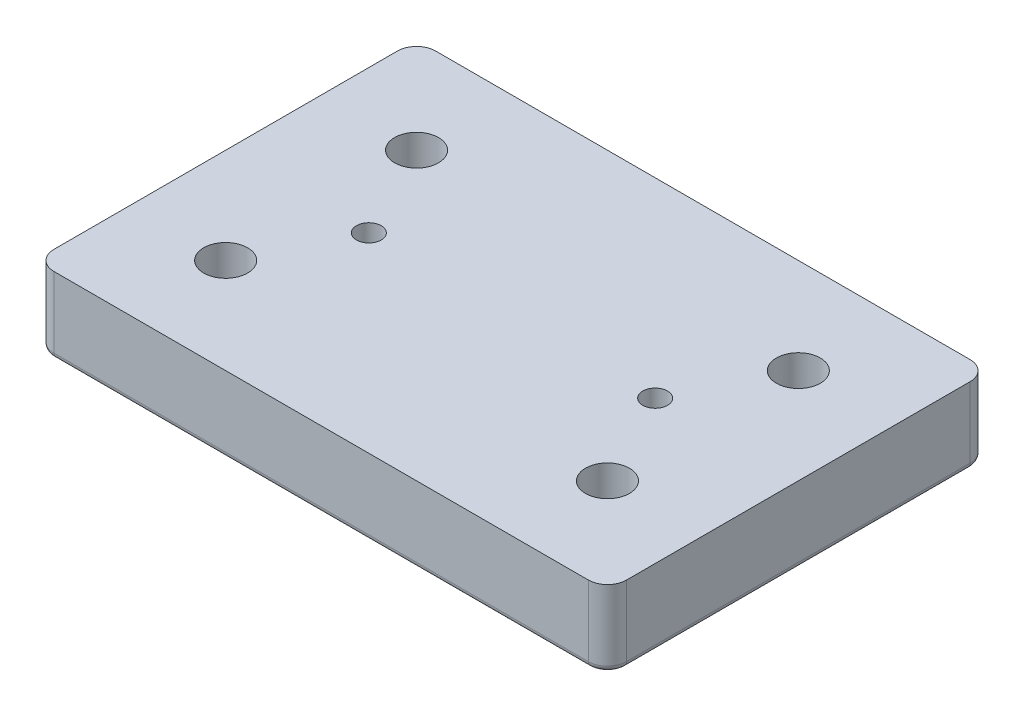
ISO-10303-21;
HEADER;
FILE_DESCRIPTION(('STEP AP214'),'2;1');
FILE_NAME('part.step','',(''),(''),'','','');
FILE_SCHEMA(('AUTOMOTIVE_DESIGN { 1 0 10303 214 1 1 1 1 }'));
ENDSEC;
DATA;
#1=APPLICATION_CONTEXT('core data for automotive mechanical design processes');
#2=APPLICATION_PROTOCOL_DEFINITION('international standard','automotive_design',2000,#1);
#3=PRODUCT_CONTEXT('',#1,'mechanical');
#4=PRODUCT('Part','Part','',(#3));
#5=PRODUCT_RELATED_PRODUCT_CATEGORY('part','',(#4));
#6=PRODUCT_DEFINITION_FORMATION('','',#4);
#7=PRODUCT_DEFINITION_CONTEXT('part definition',#1,'design');
#8=PRODUCT_DEFINITION('design','',#6,#7);
#9=PRODUCT_DEFINITION_SHAPE('','',#8);
#10=(LENGTH_UNIT() NAMED_UNIT(*) SI_UNIT(.MILLI.,.METRE.));
#11=(NAMED_UNIT(*) PLANE_ANGLE_UNIT() SI_UNIT($,.RADIAN.));
#12=(NAMED_UNIT(*) SI_UNIT($,.STERADIAN.) SOLID_ANGLE_UNIT());
#13=UNCERTAINTY_MEASURE_WITH_UNIT(LENGTH_MEASURE(1.E-05),#10,'distance_accuracy_value','');
#14=(GEOMETRIC_REPRESENTATION_CONTEXT(3) GLOBAL_UNCERTAINTY_ASSIGNED_CONTEXT((#13)) GLOBAL_UNIT_ASSIGNED_CONTEXT((#10,
#11,#12)) REPRESENTATION_CONTEXT('',''));
#15=CARTESIAN_POINT('',(0.,0.,0.));
#16=DIRECTION('',(0.,0.,1.));
#17=DIRECTION('',(1.,0.,0.));
#18=AXIS2_PLACEMENT_3D('',#15,#16,#17);
#19=CARTESIAN_POINT('',(0.,0.,0.));
#20=DIRECTION('',(0.,-1.,0.));
#21=DIRECTION('',(0.,0.,-1.));
#22=AXIS2_PLACEMENT_3D('',#19,#20,#21);
#23=PLANE('',#22);
#24=CARTESIAN_POINT('',(-10.,0.,5.));
#25=DIRECTION('',(0.,-1.,0.));
#26=DIRECTION('',(0.,0.,-1.));
#27=AXIS2_PLACEMENT_3D('',#24,#25,#26);
#28=CIRCLE('',#27,1.15);
#29=CARTESIAN_POINT('',(-10.,0.,3.85));
#30=VERTEX_POINT('',#29);
#31=EDGE_CURVE('E188',#30,#30,#28,.T.);
#32=ORIENTED_EDGE('',*,*,#31,.F.);
#33=EDGE_LOOP('',(#32));
#34=FACE_BOUND('',#33,.T.);
#35=CARTESIAN_POINT('',(10.,0.,-5.));
#36=DIRECTION('',(0.,-1.,0.));
#37=DIRECTION('',(0.,0.,-1.));
#38=AXIS2_PLACEMENT_3D('',#35,#36,#37);
#39=CIRCLE('',#38,1.15);
#40=CARTESIAN_POINT('',(10.,0.,-6.15));
#41=VERTEX_POINT('',#40);
#42=EDGE_CURVE('E196',#41,#41,#39,.T.);
#43=ORIENTED_EDGE('',*,*,#42,.F.);
#44=EDGE_LOOP('',(#43));
#45=FACE_BOUND('',#44,.T.);
#46=CARTESIAN_POINT('',(-10.,0.,-5.));
#47=DIRECTION('',(0.,-1.,0.));
#48=DIRECTION('',(0.,0.,-1.));
#49=AXIS2_PLACEMENT_3D('',#46,#47,#48);
#50=CIRCLE('',#49,1.15);
#51=CARTESIAN_POINT('',(-10.,0.,-6.15));
#52=VERTEX_POINT('',#51);
#53=EDGE_CURVE('E192',#52,#52,#50,.T.);
#54=ORIENTED_EDGE('',*,*,#53,.F.);
#55=EDGE_LOOP('',(#54));
#56=FACE_BOUND('',#55,.T.);
#57=CARTESIAN_POINT('',(10.,0.,5.));
#58=DIRECTION('',(0.,-1.,0.));
#59=DIRECTION('',(0.,0.,-1.));
#60=AXIS2_PLACEMENT_3D('',#57,#58,#59);
#61=CIRCLE('',#60,1.15);
#62=CARTESIAN_POINT('',(10.,0.,3.85));
#63=VERTEX_POINT('',#62);
#64=EDGE_CURVE('E189',#63,#63,#61,.T.);
#65=ORIENTED_EDGE('',*,*,#64,.F.);
#66=EDGE_LOOP('',(#65));
#67=FACE_BOUND('',#66,.T.);
#68=CARTESIAN_POINT('',(7.5,0.,0.));
#69=DIRECTION('',(0.,1.,0.));
#70=DIRECTION('',(0.,0.,1.));
#71=AXIS2_PLACEMENT_3D('',#68,#69,#70);
#72=CIRCLE('',#71,0.649999999999999);
#73=CARTESIAN_POINT('',(7.5,0.,0.649999999999999));
#74=VERTEX_POINT('',#73);
#75=EDGE_CURVE('E325',#74,#74,#72,.T.);
#76=ORIENTED_EDGE('',*,*,#75,.T.);
#77=EDGE_LOOP('',(#76));
#78=FACE_BOUND('',#77,.T.);
#79=CARTESIAN_POINT('',(-7.5,0.,0.));
#80=DIRECTION('',(0.,1.,0.));
#81=DIRECTION('',(0.,0.,-1.));
#82=AXIS2_PLACEMENT_3D('',#79,#80,#81);
#83=CIRCLE('',#82,0.65);
#84=CARTESIAN_POINT('',(-7.5,0.,-0.649999999999998));
#85=VERTEX_POINT('',#84);
#86=EDGE_CURVE('E331',#85,#85,#83,.T.);
#87=ORIENTED_EDGE('',*,*,#86,.T.);
#88=EDGE_LOOP('',(#87));
#89=FACE_BOUND('',#88,.T.);
#90=CARTESIAN_POINT('',(-14.,0.,9.));
#91=DIRECTION('',(0.,-1.,0.));
#92=DIRECTION('',(0.,0.,-1.));
#93=AXIS2_PLACEMENT_3D('',#90,#91,#92);
#94=CIRCLE('',#93,0.7);
#95=CARTESIAN_POINT('',(-14.7,0.,9.));
#96=VERTEX_POINT('',#95);
#97=CARTESIAN_POINT('',(-14.,0.,9.7));
#98=VERTEX_POINT('',#97);
#99=EDGE_CURVE('E202',#96,#98,#94,.F.);
#100=ORIENTED_EDGE('',*,*,#99,.F.);
#101=DIRECTION('',(0.,0.,1.));
#102=VECTOR('',#101,1.);
#103=CARTESIAN_POINT('',(-14.7,0.,-10.));
#104=LINE('',#103,#102);
#105=CARTESIAN_POINT('',(-14.7,0.,-9.));
#106=VERTEX_POINT('',#105);
#107=EDGE_CURVE('E145',#96,#106,#104,.F.);
#108=ORIENTED_EDGE('',*,*,#107,.T.);
#109=CARTESIAN_POINT('',(-14.,0.,-9.));
#110=DIRECTION('',(0.,-1.,0.));
#111=DIRECTION('',(0.,0.,-1.));
#112=AXIS2_PLACEMENT_3D('',#109,#110,#111);
#113=CIRCLE('',#112,0.7);
#114=CARTESIAN_POINT('',(-14.,0.,-9.7));
#115=VERTEX_POINT('',#114);
#116=EDGE_CURVE('E140',#115,#106,#113,.F.);
#117=ORIENTED_EDGE('',*,*,#116,.F.);
#118=DIRECTION('',(-1.,0.,0.));
#119=VECTOR('',#118,1.);
#120=CARTESIAN_POINT('',(15.,0.,-9.7));
#121=LINE('',#120,#119);
#122=CARTESIAN_POINT('',(14.,0.,-9.7));
#123=VERTEX_POINT('',#122);
#124=EDGE_CURVE('E133',#115,#123,#121,.F.);
#125=ORIENTED_EDGE('',*,*,#124,.T.);
#126=CARTESIAN_POINT('',(14.,0.,-9.));
#127=DIRECTION('',(0.,-1.,0.));
#128=DIRECTION('',(0.,0.,-1.));
#129=AXIS2_PLACEMENT_3D('',#126,#127,#128);
#130=CIRCLE('',#129,0.7);
#131=CARTESIAN_POINT('',(14.7,0.,-9.));
#132=VERTEX_POINT('',#131);
#133=EDGE_CURVE('E137',#132,#123,#130,.F.);
#134=ORIENTED_EDGE('',*,*,#133,.F.);
#135=DIRECTION('',(0.,0.,-1.));
#136=VECTOR('',#135,1.);
#137=CARTESIAN_POINT('',(14.7,0.,10.));
#138=LINE('',#137,#136);
#139=CARTESIAN_POINT('',(14.7,0.,9.));
#140=VERTEX_POINT('',#139);
#141=EDGE_CURVE('E144',#132,#140,#138,.F.);
#142=ORIENTED_EDGE('',*,*,#141,.T.);
#143=CARTESIAN_POINT('',(14.,0.,9.));
#144=DIRECTION('',(0.,-1.,0.));
#145=DIRECTION('',(0.,0.,-1.));
#146=AXIS2_PLACEMENT_3D('',#143,#144,#145);
#147=CIRCLE('',#146,0.7);
#148=CARTESIAN_POINT('',(14.,0.,9.7));
#149=VERTEX_POINT('',#148);
#150=EDGE_CURVE('E154',#149,#140,#147,.F.);
#151=ORIENTED_EDGE('',*,*,#150,.F.);
#152=DIRECTION('',(1.,0.,0.));
#153=VECTOR('',#152,1.);
#154=CARTESIAN_POINT('',(-15.,0.,9.7));
#155=LINE('',#154,#153);
#156=EDGE_CURVE('E252',#149,#98,#155,.F.);
#157=ORIENTED_EDGE('',*,*,#156,.T.);
#158=EDGE_LOOP('',(#100,#108,#117,#125,#134,#142,#151,#157));
#159=FACE_BOUND('',#158,.T.);
#160=ADVANCED_FACE('F41',(#34,#45,#56,#67,#78,#89,#159),#23,.T.);
#161=CARTESIAN_POINT('',(0.,4.,0.));
#162=DIRECTION('',(0.,-1.,0.));
#163=DIRECTION('',(0.,0.,-1.));
#164=AXIS2_PLACEMENT_3D('',#161,#162,#163);
#165=PLANE('',#164);
#166=CARTESIAN_POINT('',(10.,4.,5.));
#167=DIRECTION('',(0.,1.,0.));
#168=DIRECTION('',(0.,0.,1.));
#169=AXIS2_PLACEMENT_3D('',#166,#167,#168);
#170=CIRCLE('',#169,1.15);
#171=CARTESIAN_POINT('',(10.,4.,6.15));
#172=VERTEX_POINT('',#171);
#173=EDGE_CURVE('E342',#172,#172,#170,.T.);
#174=ORIENTED_EDGE('',*,*,#173,.F.);
#175=EDGE_LOOP('',(#174));
#176=FACE_BOUND('',#175,.T.);
#177=CARTESIAN_POINT('',(-10.,4.,-5.));
#178=DIRECTION('',(0.,1.,0.));
#179=DIRECTION('',(0.,0.,1.));
#180=AXIS2_PLACEMENT_3D('',#177,#178,#179);
#181=CIRCLE('',#180,1.15);
#182=CARTESIAN_POINT('',(-10.,4.,-3.85));
#183=VERTEX_POINT('',#182);
#184=EDGE_CURVE('E334',#183,#183,#181,.T.);
#185=ORIENTED_EDGE('',*,*,#184,.F.);
#186=EDGE_LOOP('',(#185));
#187=FACE_BOUND('',#186,.T.);
#188=DIRECTION('',(-1.,0.,0.));
#189=VECTOR('',#188,1.);
#190=CARTESIAN_POINT('',(-15.,4.,-10.));
#191=LINE('',#190,#189);
#192=CARTESIAN_POINT('',(14.,4.,-10.));
#193=VERTEX_POINT('',#192);
#194=CARTESIAN_POINT('',(-14.,4.,-10.));
#195=VERTEX_POINT('',#194);
#196=EDGE_CURVE('E236',#193,#195,#191,.T.);
#197=ORIENTED_EDGE('',*,*,#196,.T.);
#198=CARTESIAN_POINT('',(-14.,4.,-9.));
#199=DIRECTION('',(0.,-1.,0.));
#200=DIRECTION('',(0.,0.,-1.));
#201=AXIS2_PLACEMENT_3D('',#198,#199,#200);
#202=CIRCLE('',#201,1.);
#203=CARTESIAN_POINT('',(-15.,4.,-9.));
#204=VERTEX_POINT('',#203);
#205=EDGE_CURVE('E50',#195,#204,#202,.F.);
#206=ORIENTED_EDGE('',*,*,#205,.T.);
#207=DIRECTION('',(0.,0.,1.));
#208=VECTOR('',#207,1.);
#209=CARTESIAN_POINT('',(-15.,4.,10.));
#210=LINE('',#209,#208);
#211=CARTESIAN_POINT('',(-15.,4.,9.));
#212=VERTEX_POINT('',#211);
#213=EDGE_CURVE('E235',#204,#212,#210,.T.);
#214=ORIENTED_EDGE('',*,*,#213,.T.);
#215=CARTESIAN_POINT('',(-14.,4.,9.));
#216=DIRECTION('',(0.,-1.,0.));
#217=DIRECTION('',(0.,0.,-1.));
#218=AXIS2_PLACEMENT_3D('',#215,#216,#217);
#219=CIRCLE('',#218,1.);
#220=CARTESIAN_POINT('',(-14.,4.,10.));
#221=VERTEX_POINT('',#220);
#222=EDGE_CURVE('E58',#212,#221,#219,.F.);
#223=ORIENTED_EDGE('',*,*,#222,.T.);
#224=DIRECTION('',(1.,0.,0.));
#225=VECTOR('',#224,1.);
#226=CARTESIAN_POINT('',(-15.,4.,10.));
#227=LINE('',#226,#225);
#228=CARTESIAN_POINT('',(14.,4.,10.));
#229=VERTEX_POINT('',#228);
#230=EDGE_CURVE('E242',#221,#229,#227,.T.);
#231=ORIENTED_EDGE('',*,*,#230,.T.);
#232=CARTESIAN_POINT('',(14.,4.,9.));
#233=DIRECTION('',(0.,-1.,0.));
#234=DIRECTION('',(0.,0.,-1.));
#235=AXIS2_PLACEMENT_3D('',#232,#233,#234);
#236=CIRCLE('',#235,1.);
#237=CARTESIAN_POINT('',(15.,4.,9.));
#238=VERTEX_POINT('',#237);
#239=EDGE_CURVE('E175',#229,#238,#236,.F.);
#240=ORIENTED_EDGE('',*,*,#239,.T.);
#241=DIRECTION('',(0.,0.,-1.));
#242=VECTOR('',#241,1.);
#243=CARTESIAN_POINT('',(15.,4.,10.));
#244=LINE('',#243,#242);
#245=CARTESIAN_POINT('',(15.,4.,-9.));
#246=VERTEX_POINT('',#245);
#247=EDGE_CURVE('E246',#238,#246,#244,.T.);
#248=ORIENTED_EDGE('',*,*,#247,.T.);
#249=CARTESIAN_POINT('',(14.,4.,-9.));
#250=DIRECTION('',(0.,-1.,0.));
#251=DIRECTION('',(0.,0.,-1.));
#252=AXIS2_PLACEMENT_3D('',#249,#250,#251);
#253=CIRCLE('',#252,1.);
#254=EDGE_CURVE('E177',#246,#193,#253,.F.);
#255=ORIENTED_EDGE('',*,*,#254,.T.);
#256=EDGE_LOOP('',(#197,#206,#214,#223,#231,#240,#248,#255));
#257=FACE_BOUND('',#256,.T.);
#258=CARTESIAN_POINT('',(7.5,4.,0.));
#259=DIRECTION('',(0.,1.,0.));
#260=DIRECTION('',(0.,0.,1.));
#261=AXIS2_PLACEMENT_3D('',#258,#259,#260);
#262=CIRCLE('',#261,0.649999999999999);
#263=CARTESIAN_POINT('',(7.5,4.,0.649999999999999));
#264=VERTEX_POINT('',#263);
#265=EDGE_CURVE('E323',#264,#264,#262,.T.);
#266=ORIENTED_EDGE('',*,*,#265,.F.);
#267=EDGE_LOOP('',(#266));
#268=FACE_BOUND('',#267,.T.);
#269=CARTESIAN_POINT('',(-7.5,4.,0.));
#270=DIRECTION('',(0.,1.,0.));
#271=DIRECTION('',(0.,0.,-1.));
#272=AXIS2_PLACEMENT_3D('',#269,#270,#271);
#273=CIRCLE('',#272,0.65);
#274=CARTESIAN_POINT('',(-7.5,4.,-0.649999999999998));
#275=VERTEX_POINT('',#274);
#276=EDGE_CURVE('E329',#275,#275,#273,.T.);
#277=ORIENTED_EDGE('',*,*,#276,.F.);
#278=EDGE_LOOP('',(#277));
#279=FACE_BOUND('',#278,.T.);
#280=CARTESIAN_POINT('',(10.,4.,-5.));
#281=DIRECTION('',(0.,1.,0.));
#282=DIRECTION('',(0.,0.,1.));
#283=AXIS2_PLACEMENT_3D('',#280,#281,#282);
#284=CIRCLE('',#283,1.15);
#285=CARTESIAN_POINT('',(10.,4.,-3.85));
#286=VERTEX_POINT('',#285);
#287=EDGE_CURVE('E339',#286,#286,#284,.F.);
#288=ORIENTED_EDGE('',*,*,#287,.T.);
#289=EDGE_LOOP('',(#288));
#290=FACE_BOUND('',#289,.T.);
#291=CARTESIAN_POINT('',(-10.,4.,5.));
#292=DIRECTION('',(0.,1.,0.));
#293=DIRECTION('',(0.,0.,1.));
#294=AXIS2_PLACEMENT_3D('',#291,#292,#293);
#295=CIRCLE('',#294,1.15);
#296=CARTESIAN_POINT('',(-10.,4.,6.15));
#297=VERTEX_POINT('',#296);
#298=EDGE_CURVE('E185',#297,#297,#295,.F.);
#299=ORIENTED_EDGE('',*,*,#298,.T.);
#300=EDGE_LOOP('',(#299));
#301=FACE_BOUND('',#300,.T.);
#302=ADVANCED_FACE('F233',(#176,#187,#257,#268,#279,#290,#301),#165,.F.);
#303=CARTESIAN_POINT('',(15.,4.,10.));
#304=DIRECTION('',(-1.,0.,0.));
#305=DIRECTION('',(0.,0.,1.));
#306=AXIS2_PLACEMENT_3D('',#303,#304,#305);
#307=PLANE('',#306);
#308=DIRECTION('',(0.,0.,-1.));
#309=VECTOR('',#308,1.);
#310=CARTESIAN_POINT('',(15.,0.3,-10.));
#311=LINE('',#310,#309);
#312=CARTESIAN_POINT('',(15.,0.3,9.));
#313=VERTEX_POINT('',#312);
#314=CARTESIAN_POINT('',(15.,0.3,-9.));
#315=VERTEX_POINT('',#314);
#316=EDGE_CURVE('E244',#313,#315,#311,.T.);
#317=ORIENTED_EDGE('',*,*,#316,.T.);
#318=DIRECTION('',(0.,-1.,0.));
#319=VECTOR('',#318,1.);
#320=CARTESIAN_POINT('',(15.,4.,-9.));
#321=LINE('',#320,#319);
#322=EDGE_CURVE('E173',#315,#246,#321,.F.);
#323=ORIENTED_EDGE('',*,*,#322,.T.);
#324=ORIENTED_EDGE('',*,*,#247,.F.);
#325=DIRECTION('',(0.,-1.,0.));
#326=VECTOR('',#325,1.);
#327=CARTESIAN_POINT('',(15.,4.,9.));
#328=LINE('',#327,#326);
#329=EDGE_CURVE('E171',#238,#313,#328,.T.);
#330=ORIENTED_EDGE('',*,*,#329,.T.);
#331=EDGE_LOOP('',(#317,#323,#324,#330));
#332=FACE_BOUND('',#331,.T.);
#333=ADVANCED_FACE('F268',(#332),#307,.F.);
#334=CARTESIAN_POINT('',(-15.,4.,-10.));
#335=DIRECTION('',(0.,0.,1.));
#336=DIRECTION('',(1.,0.,0.));
#337=AXIS2_PLACEMENT_3D('',#334,#335,#336);
#338=PLANE('',#337);
#339=DIRECTION('',(-1.,0.,0.));
#340=VECTOR('',#339,1.);
#341=CARTESIAN_POINT('',(-15.,0.3,-10.));
#342=LINE('',#341,#340);
#343=CARTESIAN_POINT('',(14.,0.3,-10.));
#344=VERTEX_POINT('',#343);
#345=CARTESIAN_POINT('',(-14.,0.3,-10.));
#346=VERTEX_POINT('',#345);
#347=EDGE_CURVE('E159',#344,#346,#342,.T.);
#348=ORIENTED_EDGE('',*,*,#347,.T.);
#349=DIRECTION('',(0.,-1.,0.));
#350=VECTOR('',#349,1.);
#351=CARTESIAN_POINT('',(-14.,4.,-10.));
#352=LINE('',#351,#350);
#353=EDGE_CURVE('E66',#346,#195,#352,.F.);
#354=ORIENTED_EDGE('',*,*,#353,.T.);
#355=ORIENTED_EDGE('',*,*,#196,.F.);
#356=DIRECTION('',(0.,-1.,0.));
#357=VECTOR('',#356,1.);
#358=CARTESIAN_POINT('',(14.,4.,-10.));
#359=LINE('',#358,#357);
#360=EDGE_CURVE('E165',#193,#344,#359,.T.);
#361=ORIENTED_EDGE('',*,*,#360,.T.);
#362=EDGE_LOOP('',(#348,#354,#355,#361));
#363=FACE_BOUND('',#362,.T.);
#364=ADVANCED_FACE('F276',(#363),#338,.F.);
#365=CARTESIAN_POINT('',(-15.,4.,10.));
#366=DIRECTION('',(1.,0.,0.));
#367=DIRECTION('',(0.,0.,-1.));
#368=AXIS2_PLACEMENT_3D('',#365,#366,#367);
#369=PLANE('',#368);
#370=ORIENTED_EDGE('',*,*,#213,.F.);
#371=DIRECTION('',(0.,-1.,0.));
#372=VECTOR('',#371,1.);
#373=CARTESIAN_POINT('',(-15.,4.,-9.));
#374=LINE('',#373,#372);
#375=CARTESIAN_POINT('',(-15.,0.3,-9.));
#376=VERTEX_POINT('',#375);
#377=EDGE_CURVE('E216',#204,#376,#374,.T.);
#378=ORIENTED_EDGE('',*,*,#377,.T.);
#379=DIRECTION('',(0.,0.,1.));
#380=VECTOR('',#379,1.);
#381=CARTESIAN_POINT('',(-15.,0.3,10.));
#382=LINE('',#381,#380);
#383=CARTESIAN_POINT('',(-15.,0.3,9.));
#384=VERTEX_POINT('',#383);
#385=EDGE_CURVE('E258',#376,#384,#382,.T.);
#386=ORIENTED_EDGE('',*,*,#385,.T.);
#387=DIRECTION('',(0.,-1.,0.));
#388=VECTOR('',#387,1.);
#389=CARTESIAN_POINT('',(-15.,4.,9.));
#390=LINE('',#389,#388);
#391=EDGE_CURVE('E214',#384,#212,#390,.F.);
#392=ORIENTED_EDGE('',*,*,#391,.T.);
#393=EDGE_LOOP('',(#370,#378,#386,#392));
#394=FACE_BOUND('',#393,.T.);
#395=ADVANCED_FACE('F238',(#394),#369,.F.);
#396=CARTESIAN_POINT('',(-15.,4.,10.));
#397=DIRECTION('',(0.,0.,-1.));
#398=DIRECTION('',(-1.,0.,0.));
#399=AXIS2_PLACEMENT_3D('',#396,#397,#398);
#400=PLANE('',#399);
#401=ORIENTED_EDGE('',*,*,#230,.F.);
#402=DIRECTION('',(0.,-1.,0.));
#403=VECTOR('',#402,1.);
#404=CARTESIAN_POINT('',(-14.,4.,10.));
#405=LINE('',#404,#403);
#406=CARTESIAN_POINT('',(-14.,0.3,10.));
#407=VERTEX_POINT('',#406);
#408=EDGE_CURVE('E11',#221,#407,#405,.T.);
#409=ORIENTED_EDGE('',*,*,#408,.T.);
#410=DIRECTION('',(1.,0.,0.));
#411=VECTOR('',#410,1.);
#412=CARTESIAN_POINT('',(15.,0.3,10.));
#413=LINE('',#412,#411);
#414=CARTESIAN_POINT('',(14.,0.3,10.));
#415=VERTEX_POINT('',#414);
#416=EDGE_CURVE('E155',#407,#415,#413,.T.);
#417=ORIENTED_EDGE('',*,*,#416,.T.);
#418=DIRECTION('',(0.,-1.,0.));
#419=VECTOR('',#418,1.);
#420=CARTESIAN_POINT('',(14.,4.,10.));
#421=LINE('',#420,#419);
#422=EDGE_CURVE('E179',#415,#229,#421,.F.);
#423=ORIENTED_EDGE('',*,*,#422,.T.);
#424=EDGE_LOOP('',(#401,#409,#417,#423));
#425=FACE_BOUND('',#424,.T.);
#426=ADVANCED_FACE('F283',(#425),#400,.F.);
#427=CARTESIAN_POINT('',(7.5,4.,0.));
#428=DIRECTION('',(0.,-1.,0.));
#429=DIRECTION('',(0.,0.,-1.));
#430=AXIS2_PLACEMENT_3D('',#427,#428,#429);
#431=CYLINDRICAL_SURFACE('',#430,0.649999999999999);
#432=ORIENTED_EDGE('',*,*,#265,.T.);
#433=EDGE_LOOP('',(#432));
#434=FACE_BOUND('',#433,.T.);
#435=ORIENTED_EDGE('',*,*,#75,.F.);
#436=EDGE_LOOP('',(#435));
#437=FACE_BOUND('',#436,.T.);
#438=ADVANCED_FACE('F299',(#434,#437),#431,.F.);
#439=CARTESIAN_POINT('',(-7.5,4.,0.));
#440=DIRECTION('',(0.,-1.,0.));
#441=DIRECTION('',(0.,0.,-1.));
#442=AXIS2_PLACEMENT_3D('',#439,#440,#441);
#443=CYLINDRICAL_SURFACE('',#442,0.65);
#444=ORIENTED_EDGE('',*,*,#276,.T.);
#445=EDGE_LOOP('',(#444));
#446=FACE_BOUND('',#445,.T.);
#447=ORIENTED_EDGE('',*,*,#86,.F.);
#448=EDGE_LOOP('',(#447));
#449=FACE_BOUND('',#448,.T.);
#450=ADVANCED_FACE('F304',(#446,#449),#443,.F.);
#451=CARTESIAN_POINT('',(-10.,2.,-5.));
#452=DIRECTION('',(0.,1.,0.));
#453=DIRECTION('',(0.,0.,1.));
#454=AXIS2_PLACEMENT_3D('',#451,#452,#453);
#455=CYLINDRICAL_SURFACE('',#454,1.15);
#456=ORIENTED_EDGE('',*,*,#184,.T.);
#457=EDGE_LOOP('',(#456));
#458=FACE_BOUND('',#457,.T.);
#459=ORIENTED_EDGE('',*,*,#53,.T.);
#460=EDGE_LOOP('',(#459));
#461=FACE_BOUND('',#460,.T.);
#462=ADVANCED_FACE('F354',(#458,#461),#455,.F.);
#463=CARTESIAN_POINT('',(10.,2.,-5.));
#464=DIRECTION('',(0.,1.,0.));
#465=DIRECTION('',(0.,0.,1.));
#466=AXIS2_PLACEMENT_3D('',#463,#464,#465);
#467=CYLINDRICAL_SURFACE('',#466,1.15);
#468=ORIENTED_EDGE('',*,*,#287,.F.);
#469=EDGE_LOOP('',(#468));
#470=FACE_BOUND('',#469,.T.);
#471=ORIENTED_EDGE('',*,*,#42,.T.);
#472=EDGE_LOOP('',(#471));
#473=FACE_BOUND('',#472,.T.);
#474=ADVANCED_FACE('F350',(#470,#473),#467,.F.);
#475=CARTESIAN_POINT('',(10.,2.,5.));
#476=DIRECTION('',(0.,1.,0.));
#477=DIRECTION('',(0.,0.,1.));
#478=AXIS2_PLACEMENT_3D('',#475,#476,#477);
#479=CYLINDRICAL_SURFACE('',#478,1.15);
#480=ORIENTED_EDGE('',*,*,#173,.T.);
#481=EDGE_LOOP('',(#480));
#482=FACE_BOUND('',#481,.T.);
#483=ORIENTED_EDGE('',*,*,#64,.T.);
#484=EDGE_LOOP('',(#483));
#485=FACE_BOUND('',#484,.T.);
#486=ADVANCED_FACE('F353',(#482,#485),#479,.F.);
#487=CARTESIAN_POINT('',(-10.,2.,5.));
#488=DIRECTION('',(0.,1.,0.));
#489=DIRECTION('',(0.,0.,1.));
#490=AXIS2_PLACEMENT_3D('',#487,#488,#489);
#491=CYLINDRICAL_SURFACE('',#490,1.15);
#492=ORIENTED_EDGE('',*,*,#298,.F.);
#493=EDGE_LOOP('',(#492));
#494=FACE_BOUND('',#493,.T.);
#495=ORIENTED_EDGE('',*,*,#31,.T.);
#496=EDGE_LOOP('',(#495));
#497=FACE_BOUND('',#496,.T.);
#498=ADVANCED_FACE('F375',(#494,#497),#491,.F.);
#499=CARTESIAN_POINT('',(-14.7,0.3,10.));
#500=DIRECTION('',(0.,0.,-1.));
#501=DIRECTION('',(-1.,0.,0.));
#502=AXIS2_PLACEMENT_3D('',#499,#500,#501);
#503=CYLINDRICAL_SURFACE('',#502,0.3);
#504=ORIENTED_EDGE('',*,*,#385,.F.);
#505=CARTESIAN_POINT('',(-14.7,0.3,-9.));
#506=DIRECTION('',(0.,0.,1.));
#507=DIRECTION('',(1.,0.,0.));
#508=AXIS2_PLACEMENT_3D('',#505,#506,#507);
#509=CIRCLE('',#508,0.3);
#510=EDGE_CURVE('E209',#376,#106,#509,.T.);
#511=ORIENTED_EDGE('',*,*,#510,.T.);
#512=ORIENTED_EDGE('',*,*,#107,.F.);
#513=CARTESIAN_POINT('',(-14.7,0.3,9.));
#514=DIRECTION('',(0.,0.,-1.));
#515=DIRECTION('',(-1.,0.,0.));
#516=AXIS2_PLACEMENT_3D('',#513,#514,#515);
#517=CIRCLE('',#516,0.3);
#518=EDGE_CURVE('E207',#96,#384,#517,.T.);
#519=ORIENTED_EDGE('',*,*,#518,.T.);
#520=EDGE_LOOP('',(#504,#511,#512,#519));
#521=FACE_BOUND('',#520,.T.);
#522=ADVANCED_FACE('F378',(#521),#503,.T.);
#523=CARTESIAN_POINT('',(-15.,0.3,9.7));
#524=DIRECTION('',(-1.,0.,0.));
#525=DIRECTION('',(0.,0.,1.));
#526=AXIS2_PLACEMENT_3D('',#523,#524,#525);
#527=CYLINDRICAL_SURFACE('',#526,0.3);
#528=ORIENTED_EDGE('',*,*,#416,.F.);
#529=CARTESIAN_POINT('',(-14.,0.3,9.7));
#530=DIRECTION('',(1.,0.,0.));
#531=DIRECTION('',(0.,0.,-1.));
#532=AXIS2_PLACEMENT_3D('',#529,#530,#531);
#533=CIRCLE('',#532,0.3);
#534=EDGE_CURVE('E205',#407,#98,#533,.T.);
#535=ORIENTED_EDGE('',*,*,#534,.T.);
#536=ORIENTED_EDGE('',*,*,#156,.F.);
#537=CARTESIAN_POINT('',(14.,0.3,9.7));
#538=DIRECTION('',(-1.,0.,0.));
#539=DIRECTION('',(0.,0.,1.));
#540=AXIS2_PLACEMENT_3D('',#537,#538,#539);
#541=CIRCLE('',#540,0.3);
#542=EDGE_CURVE('E161',#149,#415,#541,.T.);
#543=ORIENTED_EDGE('',*,*,#542,.T.);
#544=EDGE_LOOP('',(#528,#535,#536,#543));
#545=FACE_BOUND('',#544,.T.);
#546=ADVANCED_FACE('F315',(#545),#527,.T.);
#547=CARTESIAN_POINT('',(-15.,0.3,-9.7));
#548=DIRECTION('',(1.,0.,0.));
#549=DIRECTION('',(0.,0.,-1.));
#550=AXIS2_PLACEMENT_3D('',#547,#548,#549);
#551=CYLINDRICAL_SURFACE('',#550,0.3);
#552=ORIENTED_EDGE('',*,*,#124,.F.);
#553=CARTESIAN_POINT('',(-14.,0.3,-9.7));
#554=DIRECTION('',(1.,0.,0.));
#555=DIRECTION('',(0.,0.,-1.));
#556=AXIS2_PLACEMENT_3D('',#553,#554,#555);
#557=CIRCLE('',#556,0.3);
#558=EDGE_CURVE('E212',#115,#346,#557,.T.);
#559=ORIENTED_EDGE('',*,*,#558,.T.);
#560=ORIENTED_EDGE('',*,*,#347,.F.);
#561=CARTESIAN_POINT('',(14.,0.3,-9.7));
#562=DIRECTION('',(-1.,0.,0.));
#563=DIRECTION('',(0.,0.,1.));
#564=AXIS2_PLACEMENT_3D('',#561,#562,#563);
#565=CIRCLE('',#564,0.3);
#566=EDGE_CURVE('E152',#344,#123,#565,.T.);
#567=ORIENTED_EDGE('',*,*,#566,.T.);
#568=EDGE_LOOP('',(#552,#559,#560,#567));
#569=FACE_BOUND('',#568,.T.);
#570=ADVANCED_FACE('F158',(#569),#551,.T.);
#571=CARTESIAN_POINT('',(14.7,0.3,10.));
#572=DIRECTION('',(0.,0.,1.));
#573=DIRECTION('',(1.,0.,0.));
#574=AXIS2_PLACEMENT_3D('',#571,#572,#573);
#575=CYLINDRICAL_SURFACE('',#574,0.3);
#576=ORIENTED_EDGE('',*,*,#316,.F.);
#577=CARTESIAN_POINT('',(14.7,0.3,9.));
#578=DIRECTION('',(0.,0.,-1.));
#579=DIRECTION('',(-1.,0.,0.));
#580=AXIS2_PLACEMENT_3D('',#577,#578,#579);
#581=CIRCLE('',#580,0.3);
#582=EDGE_CURVE('E162',#313,#140,#581,.T.);
#583=ORIENTED_EDGE('',*,*,#582,.T.);
#584=ORIENTED_EDGE('',*,*,#141,.F.);
#585=CARTESIAN_POINT('',(14.7,0.3,-9.));
#586=DIRECTION('',(0.,0.,1.));
#587=DIRECTION('',(1.,0.,0.));
#588=AXIS2_PLACEMENT_3D('',#585,#586,#587);
#589=CIRCLE('',#588,0.3);
#590=EDGE_CURVE('E153',#132,#315,#589,.T.);
#591=ORIENTED_EDGE('',*,*,#590,.T.);
#592=EDGE_LOOP('',(#576,#583,#584,#591));
#593=FACE_BOUND('',#592,.T.);
#594=ADVANCED_FACE('F264',(#593),#575,.T.);
#595=CARTESIAN_POINT('',(14.,4.,9.));
#596=DIRECTION('',(0.,-1.,0.));
#597=DIRECTION('',(0.,0.,-1.));
#598=AXIS2_PLACEMENT_3D('',#595,#596,#597);
#599=CYLINDRICAL_SURFACE('',#598,1.);
#600=ORIENTED_EDGE('',*,*,#239,.F.);
#601=ORIENTED_EDGE('',*,*,#422,.F.);
#602=CARTESIAN_POINT('',(14.,0.3,9.));
#603=DIRECTION('',(0.,-1.,0.));
#604=DIRECTION('',(0.,0.,-1.));
#605=AXIS2_PLACEMENT_3D('',#602,#603,#604);
#606=CIRCLE('',#605,1.);
#607=EDGE_CURVE('E182',#313,#415,#606,.T.);
#608=ORIENTED_EDGE('',*,*,#607,.F.);
#609=ORIENTED_EDGE('',*,*,#329,.F.);
#610=EDGE_LOOP('',(#600,#601,#608,#609));
#611=FACE_BOUND('',#610,.T.);
#612=ADVANCED_FACE('F322',(#611),#599,.T.);
#613=CARTESIAN_POINT('',(14.,0.3,9.));
#614=DIRECTION('',(0.,-1.,0.));
#615=DIRECTION('',(0.,0.,-1.));
#616=AXIS2_PLACEMENT_3D('',#613,#614,#615);
#617=TOROIDAL_SURFACE('',#616,0.7,0.3);
#618=ORIENTED_EDGE('',*,*,#542,.F.);
#619=ORIENTED_EDGE('',*,*,#150,.T.);
#620=ORIENTED_EDGE('',*,*,#582,.F.);
#621=ORIENTED_EDGE('',*,*,#607,.T.);
#622=EDGE_LOOP('',(#618,#619,#620,#621));
#623=FACE_BOUND('',#622,.T.);
#624=ADVANCED_FACE('F320',(#623),#617,.T.);
#625=CARTESIAN_POINT('',(14.,4.,-9.));
#626=DIRECTION('',(0.,-1.,0.));
#627=DIRECTION('',(0.,0.,-1.));
#628=AXIS2_PLACEMENT_3D('',#625,#626,#627);
#629=CYLINDRICAL_SURFACE('',#628,1.);
#630=ORIENTED_EDGE('',*,*,#254,.F.);
#631=ORIENTED_EDGE('',*,*,#322,.F.);
#632=CARTESIAN_POINT('',(14.,0.3,-9.));
#633=DIRECTION('',(0.,-1.,0.));
#634=DIRECTION('',(0.,0.,-1.));
#635=AXIS2_PLACEMENT_3D('',#632,#633,#634);
#636=CIRCLE('',#635,1.);
#637=EDGE_CURVE('E186',#344,#315,#636,.T.);
#638=ORIENTED_EDGE('',*,*,#637,.F.);
#639=ORIENTED_EDGE('',*,*,#360,.F.);
#640=EDGE_LOOP('',(#630,#631,#638,#639));
#641=FACE_BOUND('',#640,.T.);
#642=ADVANCED_FACE('F274',(#641),#629,.T.);
#643=CARTESIAN_POINT('',(14.,0.3,-9.));
#644=DIRECTION('',(0.,-1.,0.));
#645=DIRECTION('',(0.,0.,-1.));
#646=AXIS2_PLACEMENT_3D('',#643,#644,#645);
#647=TOROIDAL_SURFACE('',#646,0.7,0.3);
#648=ORIENTED_EDGE('',*,*,#566,.F.);
#649=ORIENTED_EDGE('',*,*,#637,.T.);
#650=ORIENTED_EDGE('',*,*,#590,.F.);
#651=ORIENTED_EDGE('',*,*,#133,.T.);
#652=EDGE_LOOP('',(#648,#649,#650,#651));
#653=FACE_BOUND('',#652,.T.);
#654=ADVANCED_FACE('F150',(#653),#647,.T.);
#655=CARTESIAN_POINT('',(-14.,4.,9.));
#656=DIRECTION('',(0.,-1.,0.));
#657=DIRECTION('',(0.,0.,-1.));
#658=AXIS2_PLACEMENT_3D('',#655,#656,#657);
#659=CYLINDRICAL_SURFACE('',#658,1.);
#660=ORIENTED_EDGE('',*,*,#222,.F.);
#661=ORIENTED_EDGE('',*,*,#391,.F.);
#662=CARTESIAN_POINT('',(-14.,0.3,9.));
#663=DIRECTION('',(0.,-1.,0.));
#664=DIRECTION('',(0.,0.,-1.));
#665=AXIS2_PLACEMENT_3D('',#662,#663,#664);
#666=CIRCLE('',#665,1.);
#667=EDGE_CURVE('E193',#407,#384,#666,.T.);
#668=ORIENTED_EDGE('',*,*,#667,.F.);
#669=ORIENTED_EDGE('',*,*,#408,.F.);
#670=EDGE_LOOP('',(#660,#661,#668,#669));
#671=FACE_BOUND('',#670,.T.);
#672=ADVANCED_FACE('F311',(#671),#659,.T.);
#673=CARTESIAN_POINT('',(-14.,0.3,9.));
#674=DIRECTION('',(0.,-1.,0.));
#675=DIRECTION('',(0.,0.,-1.));
#676=AXIS2_PLACEMENT_3D('',#673,#674,#675);
#677=TOROIDAL_SURFACE('',#676,0.7,0.3);
#678=ORIENTED_EDGE('',*,*,#518,.F.);
#679=ORIENTED_EDGE('',*,*,#99,.T.);
#680=ORIENTED_EDGE('',*,*,#534,.F.);
#681=ORIENTED_EDGE('',*,*,#667,.T.);
#682=EDGE_LOOP('',(#678,#679,#680,#681));
#683=FACE_BOUND('',#682,.T.);
#684=ADVANCED_FACE('F312',(#683),#677,.T.);
#685=CARTESIAN_POINT('',(-14.,4.,-9.));
#686=DIRECTION('',(0.,-1.,0.));
#687=DIRECTION('',(0.,0.,-1.));
#688=AXIS2_PLACEMENT_3D('',#685,#686,#687);
#689=CYLINDRICAL_SURFACE('',#688,1.);
#690=ORIENTED_EDGE('',*,*,#205,.F.);
#691=ORIENTED_EDGE('',*,*,#353,.F.);
#692=CARTESIAN_POINT('',(-14.,0.3,-9.));
#693=DIRECTION('',(0.,-1.,0.));
#694=DIRECTION('',(0.,0.,-1.));
#695=AXIS2_PLACEMENT_3D('',#692,#693,#694);
#696=CIRCLE('',#695,1.);
#697=EDGE_CURVE('E45',#376,#346,#696,.T.);
#698=ORIENTED_EDGE('',*,*,#697,.F.);
#699=ORIENTED_EDGE('',*,*,#377,.F.);
#700=EDGE_LOOP('',(#690,#691,#698,#699));
#701=FACE_BOUND('',#700,.T.);
#702=ADVANCED_FACE('F43',(#701),#689,.T.);
#703=CARTESIAN_POINT('',(-14.,0.3,-9.));
#704=DIRECTION('',(0.,-1.,0.));
#705=DIRECTION('',(0.,0.,-1.));
#706=AXIS2_PLACEMENT_3D('',#703,#704,#705);
#707=TOROIDAL_SURFACE('',#706,0.7,0.3);
#708=ORIENTED_EDGE('',*,*,#510,.F.);
#709=ORIENTED_EDGE('',*,*,#697,.T.);
#710=ORIENTED_EDGE('',*,*,#558,.F.);
#711=ORIENTED_EDGE('',*,*,#116,.T.);
#712=EDGE_LOOP('',(#708,#709,#710,#711));
#713=FACE_BOUND('',#712,.T.);
#714=ADVANCED_FACE('F228',(#713),#707,.T.);
#715=CLOSED_SHELL('',(#160,#302,#333,#364,#395,#426,#438,#450,#462,#474,#486,#498,#522,#546,
#570,#594,#612,#624,#642,#654,#672,#684,#702,#714));
#716=MANIFOLD_SOLID_BREP('B2',#715);
#717=ADVANCED_BREP_SHAPE_REPRESENTATION('',(#18,#716),#14);
#718=SHAPE_DEFINITION_REPRESENTATION(#9,#717);
ENDSEC;
END-ISO-10303-21;
